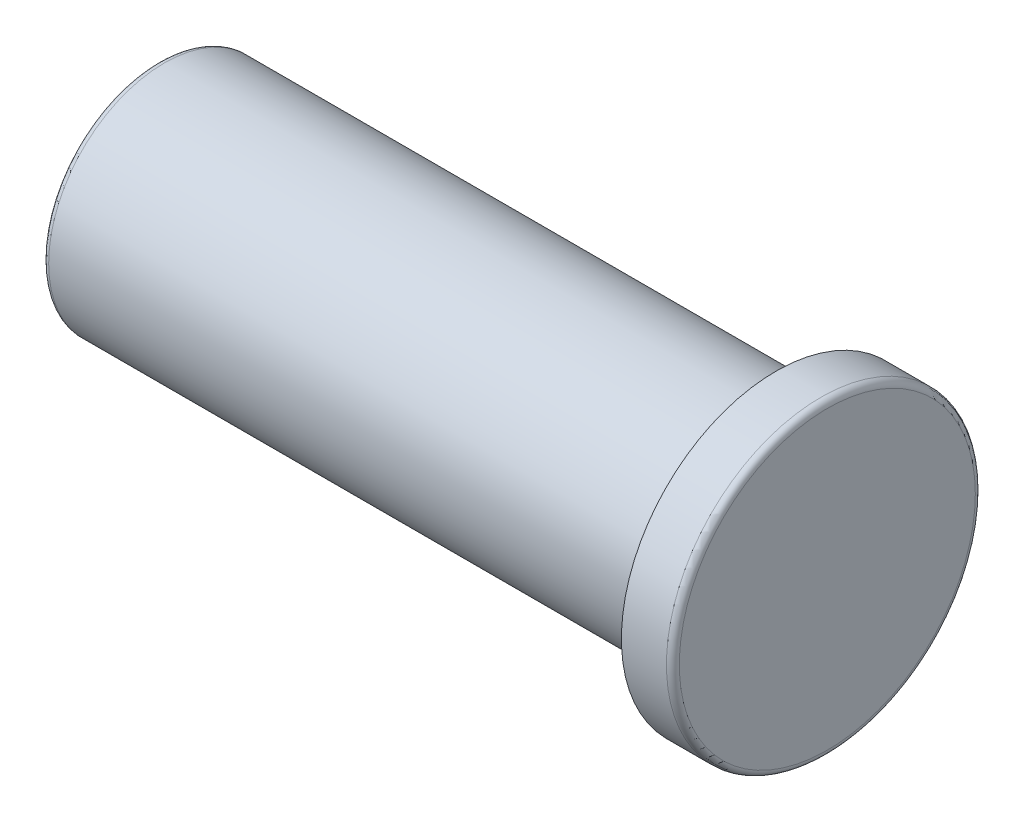
ISO-10303-21;
HEADER;
FILE_DESCRIPTION(('STEP AP214'),'2;1');
FILE_NAME('part.step','',(''),(''),'','','');
FILE_SCHEMA(('AUTOMOTIVE_DESIGN { 1 0 10303 214 1 1 1 1 }'));
ENDSEC;
DATA;
#1=APPLICATION_CONTEXT('core data for automotive mechanical design processes');
#2=APPLICATION_PROTOCOL_DEFINITION('international standard','automotive_design',2000,#1);
#3=PRODUCT_CONTEXT('',#1,'mechanical');
#4=PRODUCT('Part','Part','',(#3));
#5=PRODUCT_RELATED_PRODUCT_CATEGORY('part','',(#4));
#6=PRODUCT_DEFINITION_FORMATION('','',#4);
#7=PRODUCT_DEFINITION_CONTEXT('part definition',#1,'design');
#8=PRODUCT_DEFINITION('design','',#6,#7);
#9=PRODUCT_DEFINITION_SHAPE('','',#8);
#10=(LENGTH_UNIT() NAMED_UNIT(*) SI_UNIT(.MILLI.,.METRE.));
#11=(NAMED_UNIT(*) PLANE_ANGLE_UNIT() SI_UNIT($,.RADIAN.));
#12=(NAMED_UNIT(*) SI_UNIT($,.STERADIAN.) SOLID_ANGLE_UNIT());
#13=UNCERTAINTY_MEASURE_WITH_UNIT(LENGTH_MEASURE(1.E-05),#10,'distance_accuracy_value','');
#14=(GEOMETRIC_REPRESENTATION_CONTEXT(3) GLOBAL_UNCERTAINTY_ASSIGNED_CONTEXT((#13)) GLOBAL_UNIT_ASSIGNED_CONTEXT((#10,
#11,#12)) REPRESENTATION_CONTEXT('',''));
#15=CARTESIAN_POINT('',(0.,0.,0.));
#16=DIRECTION('',(0.,0.,1.));
#17=DIRECTION('',(1.,0.,0.));
#18=AXIS2_PLACEMENT_3D('',#15,#16,#17);
#19=CARTESIAN_POINT('',(-48.,0.,0.));
#20=DIRECTION('',(1.,0.,0.));
#21=DIRECTION('',(0.,0.,-1.));
#22=AXIS2_PLACEMENT_3D('',#19,#20,#21);
#23=CYLINDRICAL_SURFACE('',#22,9.);
#24=CARTESIAN_POINT('',(-47.5,0.,0.));
#25=DIRECTION('',(1.,0.,0.));
#26=DIRECTION('',(0.,0.,-1.));
#27=AXIS2_PLACEMENT_3D('',#24,#25,#26);
#28=CIRCLE('',#27,9.);
#29=CARTESIAN_POINT('',(-47.5,0.,-9.));
#30=VERTEX_POINT('',#29);
#31=EDGE_CURVE('E45',#30,#30,#28,.T.);
#32=ORIENTED_EDGE('',*,*,#31,.T.);
#33=EDGE_LOOP('',(#32));
#34=FACE_BOUND('',#33,.T.);
#35=CARTESIAN_POINT('',(0.,0.,0.));
#36=DIRECTION('',(1.,0.,0.));
#37=DIRECTION('',(0.,0.,-1.));
#38=AXIS2_PLACEMENT_3D('',#35,#36,#37);
#39=CIRCLE('',#38,9.);
#40=CARTESIAN_POINT('',(0.,0.,-9.));
#41=VERTEX_POINT('',#40);
#42=EDGE_CURVE('E58',#41,#41,#39,.T.);
#43=ORIENTED_EDGE('',*,*,#42,.F.);
#44=EDGE_LOOP('',(#43));
#45=FACE_BOUND('',#44,.T.);
#46=ADVANCED_FACE('F38',(#34,#45),#23,.T.);
#47=CARTESIAN_POINT('',(-48.,0.,0.));
#48=DIRECTION('',(1.,0.,0.));
#49=DIRECTION('',(0.,0.,-1.));
#50=AXIS2_PLACEMENT_3D('',#47,#48,#49);
#51=PLANE('',#50);
#52=CARTESIAN_POINT('',(-48.,0.,0.));
#53=DIRECTION('',(1.,0.,0.));
#54=DIRECTION('',(0.,0.,-1.));
#55=AXIS2_PLACEMENT_3D('',#52,#53,#54);
#56=CIRCLE('',#55,8.5);
#57=CARTESIAN_POINT('',(-48.,0.,-8.5));
#58=VERTEX_POINT('',#57);
#59=EDGE_CURVE('E10',#58,#58,#56,.F.);
#60=ORIENTED_EDGE('',*,*,#59,.T.);
#61=EDGE_LOOP('',(#60));
#62=FACE_BOUND('',#61,.T.);
#63=ADVANCED_FACE('F82',(#62),#51,.F.);
#64=CARTESIAN_POINT('',(4.,0.,0.));
#65=DIRECTION('',(-1.,0.,0.));
#66=DIRECTION('',(0.,0.,1.));
#67=AXIS2_PLACEMENT_3D('',#64,#65,#66);
#68=CYLINDRICAL_SURFACE('',#67,12.);
#69=CARTESIAN_POINT('',(3.5,0.,0.));
#70=DIRECTION('',(1.,0.,0.));
#71=DIRECTION('',(0.,0.,-1.));
#72=AXIS2_PLACEMENT_3D('',#69,#70,#71);
#73=CIRCLE('',#72,12.);
#74=CARTESIAN_POINT('',(3.5,0.,-12.));
#75=VERTEX_POINT('',#74);
#76=EDGE_CURVE('E49',#75,#75,#73,.F.);
#77=ORIENTED_EDGE('',*,*,#76,.T.);
#78=EDGE_LOOP('',(#77));
#79=FACE_BOUND('',#78,.T.);
#80=CARTESIAN_POINT('',(0.,0.,0.));
#81=DIRECTION('',(1.,0.,0.));
#82=DIRECTION('',(0.,0.,-1.));
#83=AXIS2_PLACEMENT_3D('',#80,#81,#82);
#84=CIRCLE('',#83,12.);
#85=CARTESIAN_POINT('',(0.,0.,-12.));
#86=VERTEX_POINT('',#85);
#87=EDGE_CURVE('E61',#86,#86,#84,.T.);
#88=ORIENTED_EDGE('',*,*,#87,.T.);
#89=EDGE_LOOP('',(#88));
#90=FACE_BOUND('',#89,.T.);
#91=ADVANCED_FACE('F65',(#79,#90),#68,.T.);
#92=CARTESIAN_POINT('',(4.,0.,0.));
#93=DIRECTION('',(1.,0.,0.));
#94=DIRECTION('',(0.,0.,-1.));
#95=AXIS2_PLACEMENT_3D('',#92,#93,#94);
#96=PLANE('',#95);
#97=CARTESIAN_POINT('',(4.,0.,0.));
#98=DIRECTION('',(1.,0.,0.));
#99=DIRECTION('',(0.,0.,-1.));
#100=AXIS2_PLACEMENT_3D('',#97,#98,#99);
#101=CIRCLE('',#100,11.5);
#102=CARTESIAN_POINT('',(4.,0.,-11.5));
#103=VERTEX_POINT('',#102);
#104=EDGE_CURVE('E53',#103,#103,#101,.T.);
#105=ORIENTED_EDGE('',*,*,#104,.T.);
#106=EDGE_LOOP('',(#105));
#107=FACE_BOUND('',#106,.T.);
#108=ADVANCED_FACE('F70',(#107),#96,.T.);
#109=CARTESIAN_POINT('',(0.,0.,0.));
#110=DIRECTION('',(1.,0.,0.));
#111=DIRECTION('',(0.,0.,-1.));
#112=AXIS2_PLACEMENT_3D('',#109,#110,#111);
#113=PLANE('',#112);
#114=ORIENTED_EDGE('',*,*,#42,.T.);
#115=EDGE_LOOP('',(#114));
#116=FACE_BOUND('',#115,.T.);
#117=ORIENTED_EDGE('',*,*,#87,.F.);
#118=EDGE_LOOP('',(#117));
#119=FACE_BOUND('',#118,.T.);
#120=ADVANCED_FACE('F67',(#116,#119),#113,.F.);
#121=CARTESIAN_POINT('',(3.5,0.,0.));
#122=DIRECTION('',(1.,0.,0.));
#123=DIRECTION('',(0.,0.,-1.));
#124=AXIS2_PLACEMENT_3D('',#121,#122,#123);
#125=TOROIDAL_SURFACE('',#124,11.5,0.5);
#126=ORIENTED_EDGE('',*,*,#76,.F.);
#127=EDGE_LOOP('',(#126));
#128=FACE_BOUND('',#127,.T.);
#129=ORIENTED_EDGE('',*,*,#104,.F.);
#130=EDGE_LOOP('',(#129));
#131=FACE_BOUND('',#130,.T.);
#132=ADVANCED_FACE('F69',(#128,#131),#125,.T.);
#133=CARTESIAN_POINT('',(-47.5,0.,0.));
#134=DIRECTION('',(1.,0.,0.));
#135=DIRECTION('',(0.,0.,-1.));
#136=AXIS2_PLACEMENT_3D('',#133,#134,#135);
#137=TOROIDAL_SURFACE('',#136,8.5,0.5);
#138=ORIENTED_EDGE('',*,*,#59,.F.);
#139=EDGE_LOOP('',(#138));
#140=FACE_BOUND('',#139,.T.);
#141=ORIENTED_EDGE('',*,*,#31,.F.);
#142=EDGE_LOOP('',(#141));
#143=FACE_BOUND('',#142,.T.);
#144=ADVANCED_FACE('F40',(#140,#143),#137,.T.);
#145=CLOSED_SHELL('',(#46,#63,#91,#108,#120,#132,#144));
#146=MANIFOLD_SOLID_BREP('B2',#145);
#147=ADVANCED_BREP_SHAPE_REPRESENTATION('',(#18,#146),#14);
#148=SHAPE_DEFINITION_REPRESENTATION(#9,#147);
ENDSEC;
END-ISO-10303-21;
